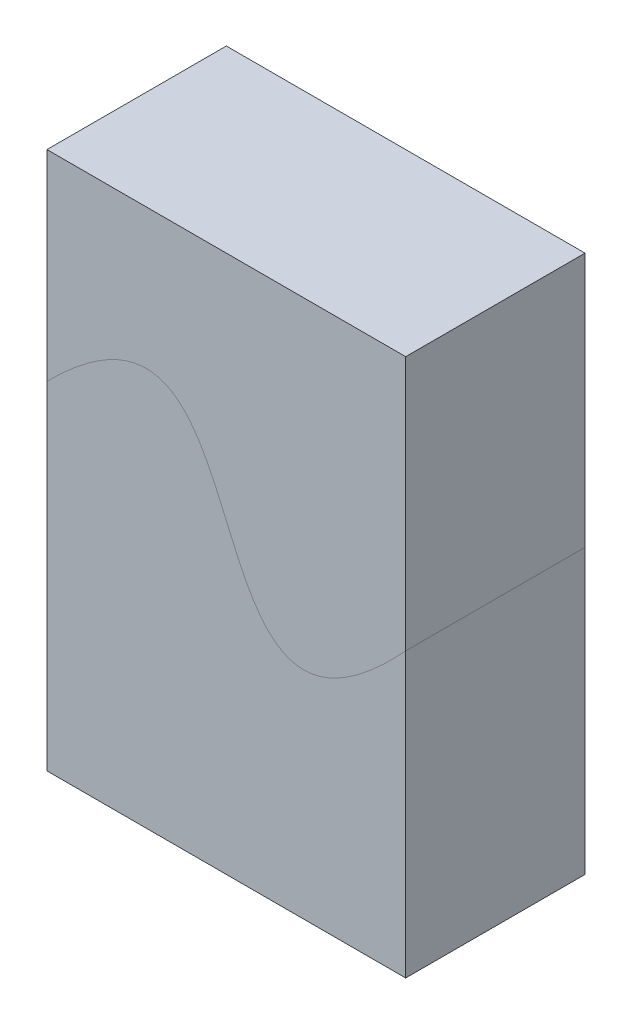
ISO-10303-21;
HEADER;
FILE_DESCRIPTION(('STEP AP214'),'2;1');
FILE_NAME('part.step','',(''),(''),'','','');
FILE_SCHEMA(('AUTOMOTIVE_DESIGN { 1 0 10303 214 1 1 1 1 }'));
ENDSEC;
DATA;
#1=APPLICATION_CONTEXT('core data for automotive mechanical design processes');
#2=APPLICATION_PROTOCOL_DEFINITION('international standard','automotive_design',2000,#1);
#3=PRODUCT_CONTEXT('',#1,'mechanical');
#4=PRODUCT('Part','Part','',(#3));
#5=PRODUCT_RELATED_PRODUCT_CATEGORY('part','',(#4));
#6=PRODUCT_DEFINITION_FORMATION('','',#4);
#7=PRODUCT_DEFINITION_CONTEXT('part definition',#1,'design');
#8=PRODUCT_DEFINITION('design','',#6,#7);
#9=PRODUCT_DEFINITION_SHAPE('','',#8);
#10=(LENGTH_UNIT() NAMED_UNIT(*) SI_UNIT(.MILLI.,.METRE.));
#11=(NAMED_UNIT(*) PLANE_ANGLE_UNIT() SI_UNIT($,.RADIAN.));
#12=(NAMED_UNIT(*) SI_UNIT($,.STERADIAN.) SOLID_ANGLE_UNIT());
#13=UNCERTAINTY_MEASURE_WITH_UNIT(LENGTH_MEASURE(1.E-05),#10,'distance_accuracy_value','');
#14=(GEOMETRIC_REPRESENTATION_CONTEXT(3) GLOBAL_UNCERTAINTY_ASSIGNED_CONTEXT((#13)) GLOBAL_UNIT_ASSIGNED_CONTEXT((#10,
#11,#12)) REPRESENTATION_CONTEXT('',''));
#15=CARTESIAN_POINT('',(0.,0.,0.));
#16=DIRECTION('',(0.,0.,1.));
#17=DIRECTION('',(1.,0.,0.));
#18=AXIS2_PLACEMENT_3D('',#15,#16,#17);
#19=CARTESIAN_POINT('',(0.,37.6158513088853,-0.00999999999999959));
#20=CARTESIAN_POINT('',(25.7925453870106,63.7832565901815,-0.00999999999999959));
#21=CARTESIAN_POINT('',(14.3856436401245,3.83829210486628,-0.00999999999999959));
#22=CARTESIAN_POINT('',(40.,31.5893405988277,-0.00999999999999959));
#23=B_SPLINE_CURVE_WITH_KNOTS('',3,(#19,#20,#21,#22),.UNSPECIFIED.,.F.,.F.,(4,4),(0.,1.),.UNSPECIFIED.);
#24=DIRECTION('',(0.,0.,1.));
#25=VECTOR('',#24,1.);
#26=SURFACE_OF_LINEAR_EXTRUSION('',#23,#25);
#27=DIRECTION('',(0.,0.,1.));
#28=VECTOR('',#27,1.);
#29=CARTESIAN_POINT('',(0.,37.6158513088853,-0.00999999999999959));
#30=LINE('',#29,#28);
#31=CARTESIAN_POINT('',(0.,37.6158513088853,0.));
#32=VERTEX_POINT('',#31);
#33=CARTESIAN_POINT('',(0.,37.6158513088853,20.));
#34=VERTEX_POINT('',#33);
#35=EDGE_CURVE('E107',#32,#34,#30,.T.);
#36=ORIENTED_EDGE('',*,*,#35,.F.);
#37=CARTESIAN_POINT('',(0.,37.6158513088853,0.));
#38=CARTESIAN_POINT('',(25.7925453870106,63.7832565901815,0.));
#39=CARTESIAN_POINT('',(14.3856436401245,3.83829210486628,0.));
#40=CARTESIAN_POINT('',(40.,31.5893405988277,0.));
#41=B_SPLINE_CURVE_WITH_KNOTS('',3,(#37,#38,#39,#40),.UNSPECIFIED.,.F.,.F.,(4,4),(0.,1.),.UNSPECIFIED.);
#42=CARTESIAN_POINT('',(40.,31.5893405988277,0.));
#43=VERTEX_POINT('',#42);
#44=EDGE_CURVE('E100',#32,#43,#41,.T.);
#45=ORIENTED_EDGE('',*,*,#44,.T.);
#46=DIRECTION('',(0.,0.,1.));
#47=VECTOR('',#46,1.);
#48=CARTESIAN_POINT('',(40.,31.5893405988277,-0.00999999999999959));
#49=LINE('',#48,#47);
#50=CARTESIAN_POINT('',(40.,31.5893405988277,20.));
#51=VERTEX_POINT('',#50);
#52=EDGE_CURVE('E104',#43,#51,#49,.T.);
#53=ORIENTED_EDGE('',*,*,#52,.T.);
#54=CARTESIAN_POINT('',(0.,37.6158513088853,20.));
#55=CARTESIAN_POINT('',(25.7925453870106,63.7832565901815,20.));
#56=CARTESIAN_POINT('',(14.3856436401245,3.83829210486628,20.));
#57=CARTESIAN_POINT('',(40.,31.5893405988277,20.));
#58=B_SPLINE_CURVE_WITH_KNOTS('',3,(#54,#55,#56,#57),.UNSPECIFIED.,.F.,.F.,(4,4),(0.,1.),.UNSPECIFIED.);
#59=EDGE_CURVE('E89',#34,#51,#58,.T.);
#60=ORIENTED_EDGE('',*,*,#59,.F.);
#61=EDGE_LOOP('',(#36,#45,#53,#60));
#62=FACE_BOUND('',#61,.T.);
#63=ADVANCED_FACE('F48',(#62),#26,.T.);
#64=CARTESIAN_POINT('',(40.,0.,20.));
#65=DIRECTION('',(-1.,0.,0.));
#66=DIRECTION('',(0.,0.,1.));
#67=AXIS2_PLACEMENT_3D('',#64,#65,#66);
#68=PLANE('',#67);
#69=ORIENTED_EDGE('',*,*,#52,.F.);
#70=DIRECTION('',(0.,1.,0.));
#71=VECTOR('',#70,1.);
#72=CARTESIAN_POINT('',(40.,0.,0.));
#73=LINE('',#72,#71);
#74=CARTESIAN_POINT('',(40.,60.,0.));
#75=VERTEX_POINT('',#74);
#76=EDGE_CURVE('E60',#43,#75,#73,.T.);
#77=ORIENTED_EDGE('',*,*,#76,.T.);
#78=DIRECTION('',(0.,0.,-1.));
#79=VECTOR('',#78,1.);
#80=CARTESIAN_POINT('',(40.,60.,20.));
#81=LINE('',#80,#79);
#82=CARTESIAN_POINT('',(40.,60.,20.));
#83=VERTEX_POINT('',#82);
#84=EDGE_CURVE('E118',#83,#75,#81,.T.);
#85=ORIENTED_EDGE('',*,*,#84,.F.);
#86=DIRECTION('',(0.,1.,0.));
#87=VECTOR('',#86,1.);
#88=CARTESIAN_POINT('',(40.,0.,20.));
#89=LINE('',#88,#87);
#90=EDGE_CURVE('E106',#51,#83,#89,.T.);
#91=ORIENTED_EDGE('',*,*,#90,.F.);
#92=EDGE_LOOP('',(#69,#77,#85,#91));
#93=FACE_BOUND('',#92,.T.);
#94=ADVANCED_FACE('F105',(#93),#68,.F.);
#95=CARTESIAN_POINT('',(0.,60.,20.));
#96=DIRECTION('',(0.,1.,0.));
#97=DIRECTION('',(0.,0.,1.));
#98=AXIS2_PLACEMENT_3D('',#95,#96,#97);
#99=PLANE('',#98);
#100=DIRECTION('',(1.,0.,0.));
#101=VECTOR('',#100,1.);
#102=CARTESIAN_POINT('',(0.,60.,0.));
#103=LINE('',#102,#101);
#104=CARTESIAN_POINT('',(0.,60.,0.));
#105=VERTEX_POINT('',#104);
#106=EDGE_CURVE('E12',#105,#75,#103,.T.);
#107=ORIENTED_EDGE('',*,*,#106,.F.);
#108=DIRECTION('',(0.,0.,-1.));
#109=VECTOR('',#108,1.);
#110=CARTESIAN_POINT('',(0.,60.,20.));
#111=LINE('',#110,#109);
#112=CARTESIAN_POINT('',(0.,60.,20.));
#113=VERTEX_POINT('',#112);
#114=EDGE_CURVE('E129',#113,#105,#111,.T.);
#115=ORIENTED_EDGE('',*,*,#114,.F.);
#116=DIRECTION('',(1.,0.,0.));
#117=VECTOR('',#116,1.);
#118=CARTESIAN_POINT('',(0.,60.,20.));
#119=LINE('',#118,#117);
#120=EDGE_CURVE('E120',#113,#83,#119,.T.);
#121=ORIENTED_EDGE('',*,*,#120,.T.);
#122=ORIENTED_EDGE('',*,*,#84,.T.);
#123=EDGE_LOOP('',(#107,#115,#121,#122));
#124=FACE_BOUND('',#123,.T.);
#125=ADVANCED_FACE('F136',(#124),#99,.T.);
#126=CARTESIAN_POINT('',(0.,0.,20.));
#127=DIRECTION('',(-1.,0.,0.));
#128=DIRECTION('',(0.,0.,1.));
#129=AXIS2_PLACEMENT_3D('',#126,#127,#128);
#130=PLANE('',#129);
#131=DIRECTION('',(0.,1.,0.));
#132=VECTOR('',#131,1.);
#133=CARTESIAN_POINT('',(0.,0.,0.));
#134=LINE('',#133,#132);
#135=EDGE_CURVE('E102',#32,#105,#134,.T.);
#136=ORIENTED_EDGE('',*,*,#135,.F.);
#137=ORIENTED_EDGE('',*,*,#35,.T.);
#138=DIRECTION('',(0.,1.,0.));
#139=VECTOR('',#138,1.);
#140=CARTESIAN_POINT('',(0.,0.,20.));
#141=LINE('',#140,#139);
#142=EDGE_CURVE('E80',#34,#113,#141,.T.);
#143=ORIENTED_EDGE('',*,*,#142,.T.);
#144=ORIENTED_EDGE('',*,*,#114,.T.);
#145=EDGE_LOOP('',(#136,#137,#143,#144));
#146=FACE_BOUND('',#145,.T.);
#147=ADVANCED_FACE('F133',(#146),#130,.T.);
#148=CARTESIAN_POINT('',(0.,0.,0.));
#149=DIRECTION('',(0.,0.,1.));
#150=DIRECTION('',(1.,0.,0.));
#151=AXIS2_PLACEMENT_3D('',#148,#149,#150);
#152=PLANE('',#151);
#153=ORIENTED_EDGE('',*,*,#44,.F.);
#154=ORIENTED_EDGE('',*,*,#135,.T.);
#155=ORIENTED_EDGE('',*,*,#106,.T.);
#156=ORIENTED_EDGE('',*,*,#76,.F.);
#157=EDGE_LOOP('',(#153,#154,#155,#156));
#158=FACE_BOUND('',#157,.T.);
#159=ADVANCED_FACE('F98',(#158),#152,.F.);
#160=CARTESIAN_POINT('',(0.,0.,20.));
#161=DIRECTION('',(0.,0.,1.));
#162=DIRECTION('',(1.,0.,0.));
#163=AXIS2_PLACEMENT_3D('',#160,#161,#162);
#164=PLANE('',#163);
#165=ORIENTED_EDGE('',*,*,#142,.F.);
#166=ORIENTED_EDGE('',*,*,#59,.T.);
#167=ORIENTED_EDGE('',*,*,#90,.T.);
#168=ORIENTED_EDGE('',*,*,#120,.F.);
#169=EDGE_LOOP('',(#165,#166,#167,#168));
#170=FACE_BOUND('',#169,.T.);
#171=ADVANCED_FACE('F50',(#170),#164,.T.);
#172=CLOSED_SHELL('',(#63,#94,#125,#147,#159,#171));
#173=MANIFOLD_SOLID_BREP('B2',#172);
#174=CARTESIAN_POINT('',(0.,37.6158513088853,-0.00999999999999959));
#175=CARTESIAN_POINT('',(25.7925453870106,63.7832565901815,-0.00999999999999959));
#176=CARTESIAN_POINT('',(14.3856436401245,3.83829210486628,-0.00999999999999959));
#177=CARTESIAN_POINT('',(40.,31.5893405988277,-0.00999999999999959));
#178=B_SPLINE_CURVE_WITH_KNOTS('',3,(#174,#175,#176,#177),.UNSPECIFIED.,.F.,.F.,(4,4),(0.,1.),.UNSPECIFIED.);
#179=DIRECTION('',(0.,0.,1.));
#180=VECTOR('',#179,1.);
#181=SURFACE_OF_LINEAR_EXTRUSION('',#178,#180);
#182=DIRECTION('',(0.,0.,1.));
#183=VECTOR('',#182,1.);
#184=CARTESIAN_POINT('',(0.,37.6158513088853,-0.00999999999999959));
#185=LINE('',#184,#183);
#186=CARTESIAN_POINT('',(0.,37.6158513088853,0.));
#187=VERTEX_POINT('',#186);
#188=CARTESIAN_POINT('',(0.,37.6158513088853,20.));
#189=VERTEX_POINT('',#188);
#190=EDGE_CURVE('E198',#187,#189,#185,.T.);
#191=ORIENTED_EDGE('',*,*,#190,.T.);
#192=CARTESIAN_POINT('',(0.,37.6158513088853,20.));
#193=CARTESIAN_POINT('',(25.7925453870106,63.7832565901815,20.));
#194=CARTESIAN_POINT('',(14.3856436401245,3.83829210486628,20.));
#195=CARTESIAN_POINT('',(40.,31.5893405988277,20.));
#196=B_SPLINE_CURVE_WITH_KNOTS('',3,(#192,#193,#194,#195),.UNSPECIFIED.,.F.,.F.,(4,4),(0.,1.),.UNSPECIFIED.);
#197=CARTESIAN_POINT('',(40.,31.5893405988277,20.));
#198=VERTEX_POINT('',#197);
#199=EDGE_CURVE('E46',#189,#198,#196,.T.);
#200=ORIENTED_EDGE('',*,*,#199,.T.);
#201=DIRECTION('',(0.,0.,1.));
#202=VECTOR('',#201,1.);
#203=CARTESIAN_POINT('',(40.,31.5893405988277,-0.00999999999999959));
#204=LINE('',#203,#202);
#205=CARTESIAN_POINT('',(40.,31.5893405988277,0.));
#206=VERTEX_POINT('',#205);
#207=EDGE_CURVE('E212',#206,#198,#204,.T.);
#208=ORIENTED_EDGE('',*,*,#207,.F.);
#209=CARTESIAN_POINT('',(0.,37.6158513088853,0.));
#210=CARTESIAN_POINT('',(25.7925453870106,63.7832565901815,0.));
#211=CARTESIAN_POINT('',(14.3856436401245,3.83829210486628,0.));
#212=CARTESIAN_POINT('',(40.,31.5893405988277,0.));
#213=B_SPLINE_CURVE_WITH_KNOTS('',3,(#209,#210,#211,#212),.UNSPECIFIED.,.F.,.F.,(4,4),(0.,1.),.UNSPECIFIED.);
#214=EDGE_CURVE('E257',#187,#206,#213,.T.);
#215=ORIENTED_EDGE('',*,*,#214,.F.);
#216=EDGE_LOOP('',(#191,#200,#208,#215));
#217=FACE_BOUND('',#216,.T.);
#218=ADVANCED_FACE('F188',(#217),#181,.F.);
#219=CARTESIAN_POINT('',(0.,0.,20.));
#220=DIRECTION('',(0.,1.,0.));
#221=DIRECTION('',(0.,0.,1.));
#222=AXIS2_PLACEMENT_3D('',#219,#220,#221);
#223=PLANE('',#222);
#224=DIRECTION('',(1.,0.,0.));
#225=VECTOR('',#224,1.);
#226=CARTESIAN_POINT('',(0.,0.,0.));
#227=LINE('',#226,#225);
#228=CARTESIAN_POINT('',(0.,0.,0.));
#229=VERTEX_POINT('',#228);
#230=CARTESIAN_POINT('',(40.,0.,0.));
#231=VERTEX_POINT('',#230);
#232=EDGE_CURVE('E243',#229,#231,#227,.T.);
#233=ORIENTED_EDGE('',*,*,#232,.T.);
#234=DIRECTION('',(0.,0.,-1.));
#235=VECTOR('',#234,1.);
#236=CARTESIAN_POINT('',(40.,0.,20.));
#237=LINE('',#236,#235);
#238=CARTESIAN_POINT('',(40.,0.,20.));
#239=VERTEX_POINT('',#238);
#240=EDGE_CURVE('E240',#239,#231,#237,.T.);
#241=ORIENTED_EDGE('',*,*,#240,.F.);
#242=DIRECTION('',(1.,0.,0.));
#243=VECTOR('',#242,1.);
#244=CARTESIAN_POINT('',(0.,0.,20.));
#245=LINE('',#244,#243);
#246=CARTESIAN_POINT('',(0.,0.,20.));
#247=VERTEX_POINT('',#246);
#248=EDGE_CURVE('E231',#247,#239,#245,.T.);
#249=ORIENTED_EDGE('',*,*,#248,.F.);
#250=DIRECTION('',(0.,0.,-1.));
#251=VECTOR('',#250,1.);
#252=CARTESIAN_POINT('',(0.,0.,20.));
#253=LINE('',#252,#251);
#254=EDGE_CURVE('E245',#247,#229,#253,.T.);
#255=ORIENTED_EDGE('',*,*,#254,.T.);
#256=EDGE_LOOP('',(#233,#241,#249,#255));
#257=FACE_BOUND('',#256,.T.);
#258=ADVANCED_FACE('F241',(#257),#223,.F.);
#259=CARTESIAN_POINT('',(40.,0.,20.));
#260=DIRECTION('',(-1.,0.,0.));
#261=DIRECTION('',(0.,0.,1.));
#262=AXIS2_PLACEMENT_3D('',#259,#260,#261);
#263=PLANE('',#262);
#264=DIRECTION('',(0.,1.,0.));
#265=VECTOR('',#264,1.);
#266=CARTESIAN_POINT('',(40.,0.,0.));
#267=LINE('',#266,#265);
#268=EDGE_CURVE('E254',#231,#206,#267,.T.);
#269=ORIENTED_EDGE('',*,*,#268,.T.);
#270=ORIENTED_EDGE('',*,*,#207,.T.);
#271=DIRECTION('',(0.,1.,0.));
#272=VECTOR('',#271,1.);
#273=CARTESIAN_POINT('',(40.,0.,20.));
#274=LINE('',#273,#272);
#275=EDGE_CURVE('E234',#239,#198,#274,.T.);
#276=ORIENTED_EDGE('',*,*,#275,.F.);
#277=ORIENTED_EDGE('',*,*,#240,.T.);
#278=EDGE_LOOP('',(#269,#270,#276,#277));
#279=FACE_BOUND('',#278,.T.);
#280=ADVANCED_FACE('F247',(#279),#263,.F.);
#281=CARTESIAN_POINT('',(0.,0.,20.));
#282=DIRECTION('',(-1.,0.,0.));
#283=DIRECTION('',(0.,0.,1.));
#284=AXIS2_PLACEMENT_3D('',#281,#282,#283);
#285=PLANE('',#284);
#286=ORIENTED_EDGE('',*,*,#190,.F.);
#287=DIRECTION('',(0.,1.,0.));
#288=VECTOR('',#287,1.);
#289=CARTESIAN_POINT('',(0.,0.,0.));
#290=LINE('',#289,#288);
#291=EDGE_CURVE('E248',#229,#187,#290,.T.);
#292=ORIENTED_EDGE('',*,*,#291,.F.);
#293=ORIENTED_EDGE('',*,*,#254,.F.);
#294=DIRECTION('',(0.,1.,0.));
#295=VECTOR('',#294,1.);
#296=CARTESIAN_POINT('',(0.,0.,20.));
#297=LINE('',#296,#295);
#298=EDGE_CURVE('E236',#247,#189,#297,.T.);
#299=ORIENTED_EDGE('',*,*,#298,.T.);
#300=EDGE_LOOP('',(#286,#292,#293,#299));
#301=FACE_BOUND('',#300,.T.);
#302=ADVANCED_FACE('F274',(#301),#285,.T.);
#303=CARTESIAN_POINT('',(0.,0.,0.));
#304=DIRECTION('',(0.,0.,1.));
#305=DIRECTION('',(1.,0.,0.));
#306=AXIS2_PLACEMENT_3D('',#303,#304,#305);
#307=PLANE('',#306);
#308=ORIENTED_EDGE('',*,*,#291,.T.);
#309=ORIENTED_EDGE('',*,*,#214,.T.);
#310=ORIENTED_EDGE('',*,*,#268,.F.);
#311=ORIENTED_EDGE('',*,*,#232,.F.);
#312=EDGE_LOOP('',(#308,#309,#310,#311));
#313=FACE_BOUND('',#312,.T.);
#314=ADVANCED_FACE('F276',(#313),#307,.F.);
#315=CARTESIAN_POINT('',(0.,0.,20.));
#316=DIRECTION('',(0.,0.,1.));
#317=DIRECTION('',(1.,0.,0.));
#318=AXIS2_PLACEMENT_3D('',#315,#316,#317);
#319=PLANE('',#318);
#320=ORIENTED_EDGE('',*,*,#199,.F.);
#321=ORIENTED_EDGE('',*,*,#298,.F.);
#322=ORIENTED_EDGE('',*,*,#248,.T.);
#323=ORIENTED_EDGE('',*,*,#275,.T.);
#324=EDGE_LOOP('',(#320,#321,#322,#323));
#325=FACE_BOUND('',#324,.T.);
#326=ADVANCED_FACE('F233',(#325),#319,.T.);
#327=CLOSED_SHELL('',(#218,#258,#280,#302,#314,#326));
#328=MANIFOLD_SOLID_BREP('B6',#327);
#329=ADVANCED_BREP_SHAPE_REPRESENTATION('',(#18,#173,#328),#14);
#330=SHAPE_DEFINITION_REPRESENTATION(#9,#329);
ENDSEC;
END-ISO-10303-21;
